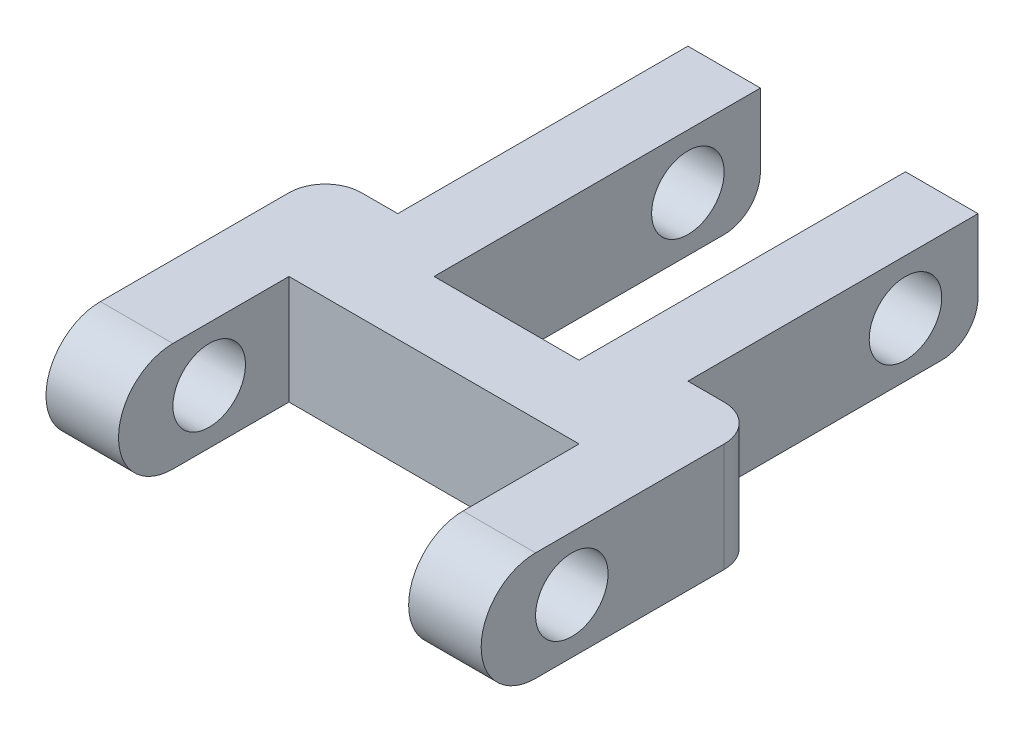
ISO-10303-21;
HEADER;
FILE_DESCRIPTION(('STEP AP214'),'2;1');
FILE_NAME('part.step','',(''),(''),'','','');
FILE_SCHEMA(('AUTOMOTIVE_DESIGN { 1 0 10303 214 1 1 1 1 }'));
ENDSEC;
DATA;
#1=APPLICATION_CONTEXT('core data for automotive mechanical design processes');
#2=APPLICATION_PROTOCOL_DEFINITION('international standard','automotive_design',2000,#1);
#3=PRODUCT_CONTEXT('',#1,'mechanical');
#4=PRODUCT('Part','Part','',(#3));
#5=PRODUCT_RELATED_PRODUCT_CATEGORY('part','',(#4));
#6=PRODUCT_DEFINITION_FORMATION('','',#4);
#7=PRODUCT_DEFINITION_CONTEXT('part definition',#1,'design');
#8=PRODUCT_DEFINITION('design','',#6,#7);
#9=PRODUCT_DEFINITION_SHAPE('','',#8);
#10=(LENGTH_UNIT() NAMED_UNIT(*) SI_UNIT(.MILLI.,.METRE.));
#11=(NAMED_UNIT(*) PLANE_ANGLE_UNIT() SI_UNIT($,.RADIAN.));
#12=(NAMED_UNIT(*) SI_UNIT($,.STERADIAN.) SOLID_ANGLE_UNIT());
#13=UNCERTAINTY_MEASURE_WITH_UNIT(LENGTH_MEASURE(1.E-05),#10,'distance_accuracy_value','');
#14=(GEOMETRIC_REPRESENTATION_CONTEXT(3) GLOBAL_UNCERTAINTY_ASSIGNED_CONTEXT((#13)) GLOBAL_UNIT_ASSIGNED_CONTEXT((#10,
#11,#12)) REPRESENTATION_CONTEXT('',''));
#15=CARTESIAN_POINT('',(0.,0.,0.));
#16=DIRECTION('',(0.,0.,1.));
#17=DIRECTION('',(1.,0.,0.));
#18=AXIS2_PLACEMENT_3D('',#15,#16,#17);
#19=CARTESIAN_POINT('',(-6.,3.,0.));
#20=DIRECTION('',(0.,0.,1.));
#21=DIRECTION('',(1.,0.,0.));
#22=AXIS2_PLACEMENT_3D('',#19,#20,#21);
#23=PLANE('',#22);
#24=DIRECTION('',(0.,1.,0.));
#25=VECTOR('',#24,1.);
#26=CARTESIAN_POINT('',(4.,3.,0.));
#27=LINE('',#26,#25);
#28=CARTESIAN_POINT('',(4.,0.,0.));
#29=VERTEX_POINT('',#28);
#30=CARTESIAN_POINT('',(4.,3.,0.));
#31=VERTEX_POINT('',#30);
#32=EDGE_CURVE('E204',#29,#31,#27,.T.);
#33=ORIENTED_EDGE('',*,*,#32,.T.);
#34=DIRECTION('',(-1.,0.,0.));
#35=VECTOR('',#34,1.);
#36=CARTESIAN_POINT('',(-6.,3.,0.));
#37=LINE('',#36,#35);
#38=CARTESIAN_POINT('',(5.,3.,0.));
#39=VERTEX_POINT('',#38);
#40=EDGE_CURVE('E278',#39,#31,#37,.T.);
#41=ORIENTED_EDGE('',*,*,#40,.F.);
#42=DIRECTION('',(0.,-1.,0.));
#43=VECTOR('',#42,1.);
#44=CARTESIAN_POINT('',(5.,3.,0.));
#45=LINE('',#44,#43);
#46=CARTESIAN_POINT('',(5.,0.,0.));
#47=VERTEX_POINT('',#46);
#48=EDGE_CURVE('E308',#39,#47,#45,.T.);
#49=ORIENTED_EDGE('',*,*,#48,.T.);
#50=DIRECTION('',(-1.,0.,0.));
#51=VECTOR('',#50,1.);
#52=CARTESIAN_POINT('',(-6.,0.,0.));
#53=LINE('',#52,#51);
#54=EDGE_CURVE('E294',#47,#29,#53,.T.);
#55=ORIENTED_EDGE('',*,*,#54,.T.);
#56=EDGE_LOOP('',(#33,#41,#49,#55));
#57=FACE_BOUND('',#56,.T.);
#58=ADVANCED_FACE('F35',(#57),#23,.F.);
#59=DIRECTION('',(0.,-1.,0.));
#60=VECTOR('',#59,1.);
#61=CARTESIAN_POINT('',(-4.,0.,0.));
#62=LINE('',#61,#60);
#63=CARTESIAN_POINT('',(-4.,3.,0.));
#64=VERTEX_POINT('',#63);
#65=CARTESIAN_POINT('',(-4.,0.,0.));
#66=VERTEX_POINT('',#65);
#67=EDGE_CURVE('E202',#64,#66,#62,.T.);
#68=ORIENTED_EDGE('',*,*,#67,.T.);
#69=CARTESIAN_POINT('',(-5.,0.,0.));
#70=VERTEX_POINT('',#69);
#71=EDGE_CURVE('E293',#66,#70,#53,.T.);
#72=ORIENTED_EDGE('',*,*,#71,.T.);
#73=DIRECTION('',(0.,-1.,0.));
#74=VECTOR('',#73,1.);
#75=CARTESIAN_POINT('',(-5.,3.,0.));
#76=LINE('',#75,#74);
#77=CARTESIAN_POINT('',(-5.,3.,0.));
#78=VERTEX_POINT('',#77);
#79=EDGE_CURVE('E305',#70,#78,#76,.F.);
#80=ORIENTED_EDGE('',*,*,#79,.T.);
#81=EDGE_CURVE('E277',#64,#78,#37,.T.);
#82=ORIENTED_EDGE('',*,*,#81,.F.);
#83=EDGE_LOOP('',(#68,#72,#80,#82));
#84=FACE_BOUND('',#83,.T.);
#85=ADVANCED_FACE('F358',(#84),#23,.F.);
#86=CARTESIAN_POINT('',(-4.,3.,8.7));
#87=DIRECTION('',(-1.,0.,0.));
#88=DIRECTION('',(0.,0.,1.));
#89=AXIS2_PLACEMENT_3D('',#86,#87,#88);
#90=PLANE('',#89);
#91=CARTESIAN_POINT('',(-4.,1.5,5.2));
#92=DIRECTION('',(-1.,0.,0.));
#93=DIRECTION('',(0.,0.,1.));
#94=AXIS2_PLACEMENT_3D('',#91,#92,#93);
#95=CIRCLE('',#94,1.);
#96=CARTESIAN_POINT('',(-4.,1.5,6.2));
#97=VERTEX_POINT('',#96);
#98=EDGE_CURVE('E247',#97,#97,#95,.T.);
#99=ORIENTED_EDGE('',*,*,#98,.T.);
#100=EDGE_LOOP('',(#99));
#101=FACE_BOUND('',#100,.T.);
#102=CARTESIAN_POINT('',(-4.,1.5,6.2));
#103=DIRECTION('',(-1.,0.,0.));
#104=DIRECTION('',(0.,0.,1.));
#105=AXIS2_PLACEMENT_3D('',#102,#103,#104);
#106=CIRCLE('',#105,1.5);
#107=CARTESIAN_POINT('',(-4.,0.,6.2));
#108=VERTEX_POINT('',#107);
#109=CARTESIAN_POINT('',(-4.,3.,6.2));
#110=VERTEX_POINT('',#109);
#111=EDGE_CURVE('E263',#108,#110,#106,.T.);
#112=ORIENTED_EDGE('',*,*,#111,.F.);
#113=DIRECTION('',(0.,0.,-1.));
#114=VECTOR('',#113,1.);
#115=CARTESIAN_POINT('',(-4.,0.,8.7));
#116=LINE('',#115,#114);
#117=CARTESIAN_POINT('',(-4.,0.,3.));
#118=VERTEX_POINT('',#117);
#119=EDGE_CURVE('E265',#108,#118,#116,.T.);
#120=ORIENTED_EDGE('',*,*,#119,.T.);
#121=DIRECTION('',(0.,-1.,0.));
#122=VECTOR('',#121,1.);
#123=CARTESIAN_POINT('',(-4.,3.,3.));
#124=LINE('',#123,#122);
#125=CARTESIAN_POINT('',(-4.,3.,3.));
#126=VERTEX_POINT('',#125);
#127=EDGE_CURVE('E299',#126,#118,#124,.T.);
#128=ORIENTED_EDGE('',*,*,#127,.F.);
#129=DIRECTION('',(0.,0.,-1.));
#130=VECTOR('',#129,1.);
#131=CARTESIAN_POINT('',(-4.,3.,8.7));
#132=LINE('',#131,#130);
#133=EDGE_CURVE('E266',#110,#126,#132,.T.);
#134=ORIENTED_EDGE('',*,*,#133,.F.);
#135=EDGE_LOOP('',(#112,#120,#128,#134));
#136=FACE_BOUND('',#135,.T.);
#137=ADVANCED_FACE('F389',(#101,#136),#90,.F.);
#138=CARTESIAN_POINT('',(4.,3.,3.));
#139=DIRECTION('',(1.,0.,0.));
#140=DIRECTION('',(0.,0.,-1.));
#141=AXIS2_PLACEMENT_3D('',#138,#139,#140);
#142=PLANE('',#141);
#143=CARTESIAN_POINT('',(4.,1.5,5.2));
#144=DIRECTION('',(1.,0.,0.));
#145=DIRECTION('',(0.,0.,-1.));
#146=AXIS2_PLACEMENT_3D('',#143,#144,#145);
#147=CIRCLE('',#146,1.);
#148=CARTESIAN_POINT('',(4.,1.5,4.2));
#149=VERTEX_POINT('',#148);
#150=EDGE_CURVE('E242',#149,#149,#147,.T.);
#151=ORIENTED_EDGE('',*,*,#150,.T.);
#152=EDGE_LOOP('',(#151));
#153=FACE_BOUND('',#152,.T.);
#154=CARTESIAN_POINT('',(4.,1.5,6.2));
#155=DIRECTION('',(1.,0.,0.));
#156=DIRECTION('',(0.,0.,-1.));
#157=AXIS2_PLACEMENT_3D('',#154,#155,#156);
#158=CIRCLE('',#157,1.5);
#159=CARTESIAN_POINT('',(4.,3.,6.2));
#160=VERTEX_POINT('',#159);
#161=CARTESIAN_POINT('',(4.,0.,6.2));
#162=VERTEX_POINT('',#161);
#163=EDGE_CURVE('E259',#160,#162,#158,.T.);
#164=ORIENTED_EDGE('',*,*,#163,.F.);
#165=DIRECTION('',(0.,0.,1.));
#166=VECTOR('',#165,1.);
#167=CARTESIAN_POINT('',(4.,3.,3.));
#168=LINE('',#167,#166);
#169=CARTESIAN_POINT('',(4.,3.,3.));
#170=VERTEX_POINT('',#169);
#171=EDGE_CURVE('E271',#170,#160,#168,.T.);
#172=ORIENTED_EDGE('',*,*,#171,.F.);
#173=DIRECTION('',(0.,-1.,0.));
#174=VECTOR('',#173,1.);
#175=CARTESIAN_POINT('',(4.,3.,3.));
#176=LINE('',#175,#174);
#177=CARTESIAN_POINT('',(4.,0.,3.));
#178=VERTEX_POINT('',#177);
#179=EDGE_CURVE('E283',#170,#178,#176,.T.);
#180=ORIENTED_EDGE('',*,*,#179,.T.);
#181=DIRECTION('',(0.,0.,1.));
#182=VECTOR('',#181,1.);
#183=CARTESIAN_POINT('',(4.,0.,3.));
#184=LINE('',#183,#182);
#185=EDGE_CURVE('E287',#178,#162,#184,.T.);
#186=ORIENTED_EDGE('',*,*,#185,.T.);
#187=EDGE_LOOP('',(#164,#172,#180,#186));
#188=FACE_BOUND('',#187,.T.);
#189=ADVANCED_FACE('F396',(#153,#188),#142,.F.);
#190=CARTESIAN_POINT('',(6.,3.,8.7));
#191=DIRECTION('',(-1.,0.,0.));
#192=DIRECTION('',(0.,0.,1.));
#193=AXIS2_PLACEMENT_3D('',#190,#191,#192);
#194=PLANE('',#193);
#195=CARTESIAN_POINT('',(6.,1.5,5.2));
#196=DIRECTION('',(-1.,0.,0.));
#197=DIRECTION('',(0.,0.,1.));
#198=AXIS2_PLACEMENT_3D('',#195,#196,#197);
#199=CIRCLE('',#198,1.);
#200=CARTESIAN_POINT('',(6.,1.5,6.2));
#201=VERTEX_POINT('',#200);
#202=EDGE_CURVE('E239',#201,#201,#199,.T.);
#203=ORIENTED_EDGE('',*,*,#202,.T.);
#204=EDGE_LOOP('',(#203));
#205=FACE_BOUND('',#204,.T.);
#206=DIRECTION('',(0.,0.,-1.));
#207=VECTOR('',#206,1.);
#208=CARTESIAN_POINT('',(6.,0.,8.7));
#209=LINE('',#208,#207);
#210=CARTESIAN_POINT('',(6.00000000000001,0.,6.2));
#211=VERTEX_POINT('',#210);
#212=CARTESIAN_POINT('',(6.,0.,1.));
#213=VERTEX_POINT('',#212);
#214=EDGE_CURVE('E290',#211,#213,#209,.T.);
#215=ORIENTED_EDGE('',*,*,#214,.T.);
#216=DIRECTION('',(0.,-1.,0.));
#217=VECTOR('',#216,1.);
#218=CARTESIAN_POINT('',(6.,3.,1.));
#219=LINE('',#218,#217);
#220=CARTESIAN_POINT('',(6.,3.,1.));
#221=VERTEX_POINT('',#220);
#222=EDGE_CURVE('E316',#213,#221,#219,.F.);
#223=ORIENTED_EDGE('',*,*,#222,.T.);
#224=DIRECTION('',(0.,0.,-1.));
#225=VECTOR('',#224,1.);
#226=CARTESIAN_POINT('',(6.,3.,8.7));
#227=LINE('',#226,#225);
#228=CARTESIAN_POINT('',(6.00000000000001,3.,6.2));
#229=VERTEX_POINT('',#228);
#230=EDGE_CURVE('E274',#229,#221,#227,.T.);
#231=ORIENTED_EDGE('',*,*,#230,.F.);
#232=CARTESIAN_POINT('',(6.00000000000001,1.5,6.2));
#233=DIRECTION('',(-1.,0.,0.));
#234=DIRECTION('',(0.,0.,1.));
#235=AXIS2_PLACEMENT_3D('',#232,#233,#234);
#236=CIRCLE('',#235,1.5);
#237=EDGE_CURVE('E251',#211,#229,#236,.T.);
#238=ORIENTED_EDGE('',*,*,#237,.F.);
#239=EDGE_LOOP('',(#215,#223,#231,#238));
#240=FACE_BOUND('',#239,.T.);
#241=ADVANCED_FACE('F393',(#205,#240),#194,.F.);
#242=CARTESIAN_POINT('',(-6.,3.,0.));
#243=DIRECTION('',(1.,0.,0.));
#244=DIRECTION('',(0.,0.,-1.));
#245=AXIS2_PLACEMENT_3D('',#242,#243,#244);
#246=PLANE('',#245);
#247=CARTESIAN_POINT('',(-6.,1.5,5.2));
#248=DIRECTION('',(-1.,0.,0.));
#249=DIRECTION('',(0.,0.,1.));
#250=AXIS2_PLACEMENT_3D('',#247,#248,#249);
#251=CIRCLE('',#250,1.);
#252=CARTESIAN_POINT('',(-6.,1.5,6.2));
#253=VERTEX_POINT('',#252);
#254=EDGE_CURVE('E238',#253,#253,#251,.T.);
#255=ORIENTED_EDGE('',*,*,#254,.F.);
#256=EDGE_LOOP('',(#255));
#257=FACE_BOUND('',#256,.T.);
#258=DIRECTION('',(0.,0.,1.));
#259=VECTOR('',#258,1.);
#260=CARTESIAN_POINT('',(-6.,3.,0.));
#261=LINE('',#260,#259);
#262=CARTESIAN_POINT('',(-6.,3.,1.));
#263=VERTEX_POINT('',#262);
#264=CARTESIAN_POINT('',(-6.,3.,6.2));
#265=VERTEX_POINT('',#264);
#266=EDGE_CURVE('E281',#263,#265,#261,.T.);
#267=ORIENTED_EDGE('',*,*,#266,.F.);
#268=DIRECTION('',(0.,-1.,0.));
#269=VECTOR('',#268,1.);
#270=CARTESIAN_POINT('',(-6.,3.,1.));
#271=LINE('',#270,#269);
#272=CARTESIAN_POINT('',(-6.,0.,1.));
#273=VERTEX_POINT('',#272);
#274=EDGE_CURVE('E322',#263,#273,#271,.T.);
#275=ORIENTED_EDGE('',*,*,#274,.T.);
#276=DIRECTION('',(0.,0.,1.));
#277=VECTOR('',#276,1.);
#278=CARTESIAN_POINT('',(-6.,0.,0.));
#279=LINE('',#278,#277);
#280=CARTESIAN_POINT('',(-6.,0.,6.2));
#281=VERTEX_POINT('',#280);
#282=EDGE_CURVE('E269',#273,#281,#279,.T.);
#283=ORIENTED_EDGE('',*,*,#282,.T.);
#284=CARTESIAN_POINT('',(-6.,1.5,6.2));
#285=DIRECTION('',(-1.,0.,0.));
#286=DIRECTION('',(0.,0.,1.));
#287=AXIS2_PLACEMENT_3D('',#284,#285,#286);
#288=CIRCLE('',#287,1.5);
#289=EDGE_CURVE('E250',#281,#265,#288,.T.);
#290=ORIENTED_EDGE('',*,*,#289,.T.);
#291=EDGE_LOOP('',(#267,#275,#283,#290));
#292=FACE_BOUND('',#291,.T.);
#293=ADVANCED_FACE('F367',(#257,#292),#246,.F.);
#294=CARTESIAN_POINT('',(0.,3.,0.));
#295=DIRECTION('',(0.,-1.,0.));
#296=DIRECTION('',(0.,0.,-1.));
#297=AXIS2_PLACEMENT_3D('',#294,#295,#296);
#298=PLANE('',#297);
#299=DIRECTION('',(1.,0.,0.));
#300=VECTOR('',#299,1.);
#301=CARTESIAN_POINT('',(-2.,3.,1.));
#302=LINE('',#301,#300);
#303=CARTESIAN_POINT('',(-2.,3.,1.));
#304=VERTEX_POINT('',#303);
#305=CARTESIAN_POINT('',(2.,3.,1.));
#306=VERTEX_POINT('',#305);
#307=EDGE_CURVE('E192',#304,#306,#302,.T.);
#308=ORIENTED_EDGE('',*,*,#307,.F.);
#309=DIRECTION('',(0.,0.,1.));
#310=VECTOR('',#309,1.);
#311=CARTESIAN_POINT('',(-2.,3.,-3.));
#312=LINE('',#311,#310);
#313=CARTESIAN_POINT('',(-2.,3.,-8.));
#314=VERTEX_POINT('',#313);
#315=EDGE_CURVE('E174',#314,#304,#312,.T.);
#316=ORIENTED_EDGE('',*,*,#315,.F.);
#317=DIRECTION('',(1.,0.,0.));
#318=VECTOR('',#317,1.);
#319=CARTESIAN_POINT('',(4.,3.,-8.));
#320=LINE('',#319,#318);
#321=CARTESIAN_POINT('',(-4.,3.,-8.));
#322=VERTEX_POINT('',#321);
#323=EDGE_CURVE('E227',#322,#314,#320,.T.);
#324=ORIENTED_EDGE('',*,*,#323,.F.);
#325=DIRECTION('',(0.,0.,1.));
#326=VECTOR('',#325,1.);
#327=CARTESIAN_POINT('',(-4.,3.,-8.));
#328=LINE('',#327,#326);
#329=EDGE_CURVE('E235',#322,#64,#328,.T.);
#330=ORIENTED_EDGE('',*,*,#329,.T.);
#331=ORIENTED_EDGE('',*,*,#81,.T.);
#332=CARTESIAN_POINT('',(-5.,3.,1.));
#333=DIRECTION('',(0.,-1.,0.));
#334=DIRECTION('',(0.,0.,-1.));
#335=AXIS2_PLACEMENT_3D('',#332,#333,#334);
#336=CIRCLE('',#335,1.);
#337=EDGE_CURVE('E318',#78,#263,#336,.F.);
#338=ORIENTED_EDGE('',*,*,#337,.T.);
#339=ORIENTED_EDGE('',*,*,#266,.T.);
#340=DIRECTION('',(-1.,0.,0.));
#341=VECTOR('',#340,1.);
#342=CARTESIAN_POINT('',(6.00000000000001,3.,6.2));
#343=LINE('',#342,#341);
#344=EDGE_CURVE('E253',#110,#265,#343,.T.);
#345=ORIENTED_EDGE('',*,*,#344,.F.);
#346=ORIENTED_EDGE('',*,*,#133,.T.);
#347=DIRECTION('',(1.,0.,0.));
#348=VECTOR('',#347,1.);
#349=CARTESIAN_POINT('',(-4.,3.,3.));
#350=LINE('',#349,#348);
#351=EDGE_CURVE('E268',#126,#170,#350,.T.);
#352=ORIENTED_EDGE('',*,*,#351,.T.);
#353=ORIENTED_EDGE('',*,*,#171,.T.);
#354=EDGE_CURVE('E260',#229,#160,#343,.T.);
#355=ORIENTED_EDGE('',*,*,#354,.F.);
#356=ORIENTED_EDGE('',*,*,#230,.T.);
#357=CARTESIAN_POINT('',(5.,3.,1.));
#358=DIRECTION('',(0.,-1.,0.));
#359=DIRECTION('',(0.,0.,-1.));
#360=AXIS2_PLACEMENT_3D('',#357,#358,#359);
#361=CIRCLE('',#360,1.);
#362=EDGE_CURVE('E320',#221,#39,#361,.F.);
#363=ORIENTED_EDGE('',*,*,#362,.T.);
#364=ORIENTED_EDGE('',*,*,#40,.T.);
#365=DIRECTION('',(0.,0.,1.));
#366=VECTOR('',#365,1.);
#367=CARTESIAN_POINT('',(4.,3.,-8.));
#368=LINE('',#367,#366);
#369=CARTESIAN_POINT('',(4.,3.,-8.));
#370=VERTEX_POINT('',#369);
#371=EDGE_CURVE('E233',#370,#31,#368,.T.);
#372=ORIENTED_EDGE('',*,*,#371,.F.);
#373=CARTESIAN_POINT('',(2.,3.,-8.));
#374=VERTEX_POINT('',#373);
#375=EDGE_CURVE('E226',#374,#370,#320,.T.);
#376=ORIENTED_EDGE('',*,*,#375,.F.);
#377=DIRECTION('',(0.,0.,-1.));
#378=VECTOR('',#377,1.);
#379=CARTESIAN_POINT('',(2.,3.,-8.));
#380=LINE('',#379,#378);
#381=EDGE_CURVE('E186',#306,#374,#380,.T.);
#382=ORIENTED_EDGE('',*,*,#381,.F.);
#383=EDGE_LOOP('',(#308,#316,#324,#330,#331,#338,#339,#345,#346,#352,#353,#355,#356,#363,#364,
#372,#376,#382));
#384=FACE_BOUND('',#383,.T.);
#385=ADVANCED_FACE('F196',(#384),#298,.F.);
#386=CARTESIAN_POINT('',(0.,0.,0.));
#387=DIRECTION('',(0.,-1.,0.));
#388=DIRECTION('',(0.,0.,-1.));
#389=AXIS2_PLACEMENT_3D('',#386,#387,#388);
#390=PLANE('',#389);
#391=DIRECTION('',(0.,0.,1.));
#392=VECTOR('',#391,1.);
#393=CARTESIAN_POINT('',(-2.,0.,-8.));
#394=LINE('',#393,#392);
#395=CARTESIAN_POINT('',(-2.,0.,-7.));
#396=VERTEX_POINT('',#395);
#397=CARTESIAN_POINT('',(-2.,0.,1.));
#398=VERTEX_POINT('',#397);
#399=EDGE_CURVE('E216',#396,#398,#394,.T.);
#400=ORIENTED_EDGE('',*,*,#399,.T.);
#401=DIRECTION('',(-1.,0.,0.));
#402=VECTOR('',#401,1.);
#403=CARTESIAN_POINT('',(0.,0.,1.));
#404=LINE('',#403,#402);
#405=CARTESIAN_POINT('',(2.,0.,1.));
#406=VERTEX_POINT('',#405);
#407=EDGE_CURVE('E12',#406,#398,#404,.T.);
#408=ORIENTED_EDGE('',*,*,#407,.F.);
#409=DIRECTION('',(0.,0.,-1.));
#410=VECTOR('',#409,1.);
#411=CARTESIAN_POINT('',(2.,0.,-8.));
#412=LINE('',#411,#410);
#413=CARTESIAN_POINT('',(2.,0.,-7.));
#414=VERTEX_POINT('',#413);
#415=EDGE_CURVE('E211',#406,#414,#412,.T.);
#416=ORIENTED_EDGE('',*,*,#415,.T.);
#417=DIRECTION('',(-1.,0.,0.));
#418=VECTOR('',#417,1.);
#419=CARTESIAN_POINT('',(-4.,0.,-7.));
#420=LINE('',#419,#418);
#421=CARTESIAN_POINT('',(4.,0.,-7.));
#422=VERTEX_POINT('',#421);
#423=EDGE_CURVE('E336',#414,#422,#420,.F.);
#424=ORIENTED_EDGE('',*,*,#423,.T.);
#425=DIRECTION('',(0.,0.,1.));
#426=VECTOR('',#425,1.);
#427=CARTESIAN_POINT('',(4.,0.,-8.));
#428=LINE('',#427,#426);
#429=EDGE_CURVE('E58',#422,#29,#428,.T.);
#430=ORIENTED_EDGE('',*,*,#429,.T.);
#431=ORIENTED_EDGE('',*,*,#54,.F.);
#432=CARTESIAN_POINT('',(5.,0.,1.));
#433=DIRECTION('',(0.,-1.,0.));
#434=DIRECTION('',(0.,0.,-1.));
#435=AXIS2_PLACEMENT_3D('',#432,#433,#434);
#436=CIRCLE('',#435,1.);
#437=EDGE_CURVE('E314',#47,#213,#436,.T.);
#438=ORIENTED_EDGE('',*,*,#437,.T.);
#439=ORIENTED_EDGE('',*,*,#214,.F.);
#440=DIRECTION('',(-1.,0.,0.));
#441=VECTOR('',#440,1.);
#442=CARTESIAN_POINT('',(6.00000000000001,0.,6.2));
#443=LINE('',#442,#441);
#444=EDGE_CURVE('E256',#211,#162,#443,.T.);
#445=ORIENTED_EDGE('',*,*,#444,.T.);
#446=ORIENTED_EDGE('',*,*,#185,.F.);
#447=DIRECTION('',(1.,0.,0.));
#448=VECTOR('',#447,1.);
#449=CARTESIAN_POINT('',(-4.,0.,3.));
#450=LINE('',#449,#448);
#451=EDGE_CURVE('E285',#118,#178,#450,.T.);
#452=ORIENTED_EDGE('',*,*,#451,.F.);
#453=ORIENTED_EDGE('',*,*,#119,.F.);
#454=DIRECTION('',(-1.,0.,0.));
#455=VECTOR('',#454,1.);
#456=CARTESIAN_POINT('',(6.00000000000001,0.,6.2));
#457=LINE('',#456,#455);
#458=EDGE_CURVE('E302',#108,#281,#457,.T.);
#459=ORIENTED_EDGE('',*,*,#458,.T.);
#460=ORIENTED_EDGE('',*,*,#282,.F.);
#461=CARTESIAN_POINT('',(-5.,0.,1.));
#462=DIRECTION('',(0.,-1.,0.));
#463=DIRECTION('',(0.,0.,-1.));
#464=AXIS2_PLACEMENT_3D('',#461,#462,#463);
#465=CIRCLE('',#464,1.);
#466=EDGE_CURVE('E311',#273,#70,#465,.T.);
#467=ORIENTED_EDGE('',*,*,#466,.T.);
#468=ORIENTED_EDGE('',*,*,#71,.F.);
#469=DIRECTION('',(0.,0.,1.));
#470=VECTOR('',#469,1.);
#471=CARTESIAN_POINT('',(-4.,0.,-8.));
#472=LINE('',#471,#470);
#473=CARTESIAN_POINT('',(-4.,0.,-7.));
#474=VERTEX_POINT('',#473);
#475=EDGE_CURVE('E50',#474,#66,#472,.T.);
#476=ORIENTED_EDGE('',*,*,#475,.F.);
#477=DIRECTION('',(-1.,0.,0.));
#478=VECTOR('',#477,1.);
#479=CARTESIAN_POINT('',(-4.,0.,-7.));
#480=LINE('',#479,#478);
#481=EDGE_CURVE('E334',#474,#396,#480,.F.);
#482=ORIENTED_EDGE('',*,*,#481,.T.);
#483=EDGE_LOOP('',(#400,#408,#416,#424,#430,#431,#438,#439,#445,#446,#452,#453,#459,#460,#467,
#468,#476,#482));
#484=FACE_BOUND('',#483,.T.);
#485=ADVANCED_FACE('F354',(#484),#390,.T.);
#486=CARTESIAN_POINT('',(-4.,3.,3.));
#487=DIRECTION('',(0.,0.,-1.));
#488=DIRECTION('',(-1.,0.,0.));
#489=AXIS2_PLACEMENT_3D('',#486,#487,#488);
#490=PLANE('',#489);
#491=ORIENTED_EDGE('',*,*,#451,.T.);
#492=ORIENTED_EDGE('',*,*,#179,.F.);
#493=ORIENTED_EDGE('',*,*,#351,.F.);
#494=ORIENTED_EDGE('',*,*,#127,.T.);
#495=EDGE_LOOP('',(#491,#492,#493,#494));
#496=FACE_BOUND('',#495,.T.);
#497=ADVANCED_FACE('F401',(#496),#490,.F.);
#498=CARTESIAN_POINT('',(6.00000000000001,1.5,6.2));
#499=DIRECTION('',(-1.,0.,0.));
#500=DIRECTION('',(0.,0.,1.));
#501=AXIS2_PLACEMENT_3D('',#498,#499,#500);
#502=CYLINDRICAL_SURFACE('',#501,1.5);
#503=ORIENTED_EDGE('',*,*,#111,.T.);
#504=ORIENTED_EDGE('',*,*,#344,.T.);
#505=ORIENTED_EDGE('',*,*,#289,.F.);
#506=ORIENTED_EDGE('',*,*,#458,.F.);
#507=EDGE_LOOP('',(#503,#504,#505,#506));
#508=FACE_BOUND('',#507,.T.);
#509=ADVANCED_FACE('F404',(#508),#502,.T.);
#510=ORIENTED_EDGE('',*,*,#163,.T.);
#511=ORIENTED_EDGE('',*,*,#444,.F.);
#512=ORIENTED_EDGE('',*,*,#237,.T.);
#513=ORIENTED_EDGE('',*,*,#354,.T.);
#514=EDGE_LOOP('',(#510,#511,#512,#513));
#515=FACE_BOUND('',#514,.T.);
#516=ADVANCED_FACE('F424',(#515),#502,.T.);
#517=CARTESIAN_POINT('',(6.,1.5,5.2));
#518=DIRECTION('',(-1.,0.,0.));
#519=DIRECTION('',(0.,0.,1.));
#520=AXIS2_PLACEMENT_3D('',#517,#518,#519);
#521=CYLINDRICAL_SURFACE('',#520,1.);
#522=ORIENTED_EDGE('',*,*,#254,.T.);
#523=EDGE_LOOP('',(#522));
#524=FACE_BOUND('',#523,.T.);
#525=ORIENTED_EDGE('',*,*,#98,.F.);
#526=EDGE_LOOP('',(#525));
#527=FACE_BOUND('',#526,.T.);
#528=ADVANCED_FACE('F429',(#524,#527),#521,.F.);
#529=ORIENTED_EDGE('',*,*,#202,.F.);
#530=EDGE_LOOP('',(#529));
#531=FACE_BOUND('',#530,.T.);
#532=ORIENTED_EDGE('',*,*,#150,.F.);
#533=EDGE_LOOP('',(#532));
#534=FACE_BOUND('',#533,.T.);
#535=ADVANCED_FACE('F380',(#531,#534),#521,.F.);
#536=CARTESIAN_POINT('',(5.,3.,1.));
#537=DIRECTION('',(0.,-1.,0.));
#538=DIRECTION('',(0.,0.,-1.));
#539=AXIS2_PLACEMENT_3D('',#536,#537,#538);
#540=CYLINDRICAL_SURFACE('',#539,1.);
#541=ORIENTED_EDGE('',*,*,#362,.F.);
#542=ORIENTED_EDGE('',*,*,#222,.F.);
#543=ORIENTED_EDGE('',*,*,#437,.F.);
#544=ORIENTED_EDGE('',*,*,#48,.F.);
#545=EDGE_LOOP('',(#541,#542,#543,#544));
#546=FACE_BOUND('',#545,.T.);
#547=ADVANCED_FACE('F372',(#546),#540,.T.);
#548=CARTESIAN_POINT('',(-5.,3.,1.));
#549=DIRECTION('',(0.,-1.,0.));
#550=DIRECTION('',(0.,0.,-1.));
#551=AXIS2_PLACEMENT_3D('',#548,#549,#550);
#552=CYLINDRICAL_SURFACE('',#551,1.);
#553=ORIENTED_EDGE('',*,*,#337,.F.);
#554=ORIENTED_EDGE('',*,*,#79,.F.);
#555=ORIENTED_EDGE('',*,*,#466,.F.);
#556=ORIENTED_EDGE('',*,*,#274,.F.);
#557=EDGE_LOOP('',(#553,#554,#555,#556));
#558=FACE_BOUND('',#557,.T.);
#559=ADVANCED_FACE('F369',(#558),#552,.T.);
#560=CARTESIAN_POINT('',(0.,1.,-7.));
#561=DIRECTION('',(-1.,0.,0.));
#562=DIRECTION('',(0.,0.,1.));
#563=AXIS2_PLACEMENT_3D('',#560,#561,#562);
#564=CYLINDRICAL_SURFACE('',#563,1.);
#565=CARTESIAN_POINT('',(4.,1.,-7.));
#566=DIRECTION('',(-1.,0.,0.));
#567=DIRECTION('',(0.,-1.,0.));
#568=AXIS2_PLACEMENT_3D('',#565,#566,#567);
#569=CIRCLE('',#568,1.);
#570=CARTESIAN_POINT('',(4.,1.,-8.));
#571=VERTEX_POINT('',#570);
#572=EDGE_CURVE('E338',#422,#571,#569,.F.);
#573=ORIENTED_EDGE('',*,*,#572,.F.);
#574=ORIENTED_EDGE('',*,*,#423,.F.);
#575=CARTESIAN_POINT('',(2.,1.,-7.));
#576=DIRECTION('',(1.,0.,0.));
#577=DIRECTION('',(0.,0.,-1.));
#578=AXIS2_PLACEMENT_3D('',#575,#576,#577);
#579=CIRCLE('',#578,1.);
#580=CARTESIAN_POINT('',(2.,1.,-8.));
#581=VERTEX_POINT('',#580);
#582=EDGE_CURVE('E332',#581,#414,#579,.F.);
#583=ORIENTED_EDGE('',*,*,#582,.F.);
#584=DIRECTION('',(-1.,0.,0.));
#585=VECTOR('',#584,1.);
#586=CARTESIAN_POINT('',(0.,1.,-8.));
#587=LINE('',#586,#585);
#588=EDGE_CURVE('E325',#571,#581,#587,.T.);
#589=ORIENTED_EDGE('',*,*,#588,.F.);
#590=EDGE_LOOP('',(#573,#574,#583,#589));
#591=FACE_BOUND('',#590,.T.);
#592=ADVANCED_FACE('F371',(#591),#564,.T.);
#593=CARTESIAN_POINT('',(-8.,1.49999999999999,-6.));
#594=DIRECTION('',(1.,0.,0.));
#595=DIRECTION('',(0.,1.,0.));
#596=AXIS2_PLACEMENT_3D('',#593,#594,#595);
#597=CYLINDRICAL_SURFACE('',#596,1.);
#598=CARTESIAN_POINT('',(2.,1.5,-6.));
#599=DIRECTION('',(1.,0.,0.));
#600=DIRECTION('',(0.,0.,-1.));
#601=AXIS2_PLACEMENT_3D('',#598,#599,#600);
#602=CIRCLE('',#601,1.);
#603=CARTESIAN_POINT('',(2.,1.5,-7.));
#604=VERTEX_POINT('',#603);
#605=EDGE_CURVE('E210',#604,#604,#602,.F.);
#606=ORIENTED_EDGE('',*,*,#605,.T.);
#607=EDGE_LOOP('',(#606));
#608=FACE_BOUND('',#607,.T.);
#609=CARTESIAN_POINT('',(4.,1.5,-6.));
#610=DIRECTION('',(1.,0.,0.));
#611=DIRECTION('',(0.,1.,0.));
#612=AXIS2_PLACEMENT_3D('',#609,#610,#611);
#613=CIRCLE('',#612,1.);
#614=CARTESIAN_POINT('',(4.,2.5,-6.));
#615=VERTEX_POINT('',#614);
#616=EDGE_CURVE('E218',#615,#615,#613,.T.);
#617=ORIENTED_EDGE('',*,*,#616,.T.);
#618=EDGE_LOOP('',(#617));
#619=FACE_BOUND('',#618,.T.);
#620=ADVANCED_FACE('F378',(#608,#619),#597,.F.);
#621=CARTESIAN_POINT('',(2.,-5.,-8.));
#622=DIRECTION('',(1.,0.,0.));
#623=DIRECTION('',(0.,0.,-1.));
#624=AXIS2_PLACEMENT_3D('',#621,#622,#623);
#625=PLANE('',#624);
#626=ORIENTED_EDGE('',*,*,#605,.F.);
#627=EDGE_LOOP('',(#626));
#628=FACE_BOUND('',#627,.T.);
#629=DIRECTION('',(0.,1.,0.));
#630=VECTOR('',#629,1.);
#631=CARTESIAN_POINT('',(2.,-5.,-8.));
#632=LINE('',#631,#630);
#633=EDGE_CURVE('E185',#581,#374,#632,.T.);
#634=ORIENTED_EDGE('',*,*,#633,.F.);
#635=ORIENTED_EDGE('',*,*,#582,.T.);
#636=ORIENTED_EDGE('',*,*,#415,.F.);
#637=DIRECTION('',(0.,1.,0.));
#638=VECTOR('',#637,1.);
#639=CARTESIAN_POINT('',(2.,-7.,1.));
#640=LINE('',#639,#638);
#641=EDGE_CURVE('E194',#406,#306,#640,.T.);
#642=ORIENTED_EDGE('',*,*,#641,.T.);
#643=ORIENTED_EDGE('',*,*,#381,.T.);
#644=EDGE_LOOP('',(#634,#635,#636,#642,#643));
#645=FACE_BOUND('',#644,.T.);
#646=ADVANCED_FACE('F530',(#628,#645),#625,.F.);
#647=CARTESIAN_POINT('',(0.,0.,-8.));
#648=DIRECTION('',(0.,0.,1.));
#649=DIRECTION('',(1.,0.,0.));
#650=AXIS2_PLACEMENT_3D('',#647,#648,#649);
#651=PLANE('',#650);
#652=DIRECTION('',(0.,-1.,0.));
#653=VECTOR('',#652,1.);
#654=CARTESIAN_POINT('',(4.,0.,-8.));
#655=LINE('',#654,#653);
#656=EDGE_CURVE('E229',#370,#571,#655,.T.);
#657=ORIENTED_EDGE('',*,*,#656,.T.);
#658=ORIENTED_EDGE('',*,*,#588,.T.);
#659=ORIENTED_EDGE('',*,*,#633,.T.);
#660=ORIENTED_EDGE('',*,*,#375,.T.);
#661=EDGE_LOOP('',(#657,#658,#659,#660));
#662=FACE_BOUND('',#661,.T.);
#663=ADVANCED_FACE('F540',(#662),#651,.F.);
#664=CARTESIAN_POINT('',(-2.,-5.,-3.));
#665=DIRECTION('',(-1.,0.,0.));
#666=DIRECTION('',(0.,0.,1.));
#667=AXIS2_PLACEMENT_3D('',#664,#665,#666);
#668=PLANE('',#667);
#669=CARTESIAN_POINT('',(-2.,1.5,-6.));
#670=DIRECTION('',(-1.,0.,0.));
#671=DIRECTION('',(0.,0.,1.));
#672=AXIS2_PLACEMENT_3D('',#669,#670,#671);
#673=CIRCLE('',#672,1.);
#674=CARTESIAN_POINT('',(-2.,1.5,-5.));
#675=VERTEX_POINT('',#674);
#676=EDGE_CURVE('E214',#675,#675,#673,.F.);
#677=ORIENTED_EDGE('',*,*,#676,.F.);
#678=EDGE_LOOP('',(#677));
#679=FACE_BOUND('',#678,.T.);
#680=ORIENTED_EDGE('',*,*,#399,.F.);
#681=CARTESIAN_POINT('',(-2.,1.,-7.));
#682=DIRECTION('',(-1.,0.,0.));
#683=DIRECTION('',(0.,0.,1.));
#684=AXIS2_PLACEMENT_3D('',#681,#682,#683);
#685=CIRCLE('',#684,1.);
#686=CARTESIAN_POINT('',(-2.,1.,-8.));
#687=VERTEX_POINT('',#686);
#688=EDGE_CURVE('E43',#396,#687,#685,.F.);
#689=ORIENTED_EDGE('',*,*,#688,.T.);
#690=DIRECTION('',(0.,-1.,0.));
#691=VECTOR('',#690,1.);
#692=CARTESIAN_POINT('',(-2.,0.,-8.));
#693=LINE('',#692,#691);
#694=EDGE_CURVE('E180',#314,#687,#693,.T.);
#695=ORIENTED_EDGE('',*,*,#694,.F.);
#696=ORIENTED_EDGE('',*,*,#315,.T.);
#697=DIRECTION('',(0.,1.,0.));
#698=VECTOR('',#697,1.);
#699=CARTESIAN_POINT('',(-2.,-7.,1.));
#700=LINE('',#699,#698);
#701=EDGE_CURVE('E178',#398,#304,#700,.T.);
#702=ORIENTED_EDGE('',*,*,#701,.F.);
#703=EDGE_LOOP('',(#680,#689,#695,#696,#702));
#704=FACE_BOUND('',#703,.T.);
#705=ADVANCED_FACE('F177',(#679,#704),#668,.F.);
#706=CARTESIAN_POINT('',(0.,1.,-7.));
#707=DIRECTION('',(-1.,0.,0.));
#708=DIRECTION('',(0.,0.,1.));
#709=AXIS2_PLACEMENT_3D('',#706,#707,#708);
#710=CYLINDRICAL_SURFACE('',#709,1.);
#711=ORIENTED_EDGE('',*,*,#688,.F.);
#712=ORIENTED_EDGE('',*,*,#481,.F.);
#713=CARTESIAN_POINT('',(-4.,1.,-7.));
#714=DIRECTION('',(1.,0.,0.));
#715=DIRECTION('',(0.,0.,-1.));
#716=AXIS2_PLACEMENT_3D('',#713,#714,#715);
#717=CIRCLE('',#716,1.);
#718=CARTESIAN_POINT('',(-4.,1.,-8.));
#719=VERTEX_POINT('',#718);
#720=EDGE_CURVE('E343',#719,#474,#717,.F.);
#721=ORIENTED_EDGE('',*,*,#720,.F.);
#722=DIRECTION('',(-1.,0.,0.));
#723=VECTOR('',#722,1.);
#724=CARTESIAN_POINT('',(0.,1.,-8.));
#725=LINE('',#724,#723);
#726=EDGE_CURVE('E340',#687,#719,#725,.T.);
#727=ORIENTED_EDGE('',*,*,#726,.F.);
#728=EDGE_LOOP('',(#711,#712,#721,#727));
#729=FACE_BOUND('',#728,.T.);
#730=ADVANCED_FACE('F37',(#729),#710,.T.);
#731=ORIENTED_EDGE('',*,*,#694,.T.);
#732=ORIENTED_EDGE('',*,*,#726,.T.);
#733=DIRECTION('',(0.,1.,0.));
#734=VECTOR('',#733,1.);
#735=CARTESIAN_POINT('',(-4.,3.,-8.));
#736=LINE('',#735,#734);
#737=EDGE_CURVE('E224',#719,#322,#736,.T.);
#738=ORIENTED_EDGE('',*,*,#737,.T.);
#739=ORIENTED_EDGE('',*,*,#323,.T.);
#740=EDGE_LOOP('',(#731,#732,#738,#739));
#741=FACE_BOUND('',#740,.T.);
#742=ADVANCED_FACE('F349',(#741),#651,.F.);
#743=ORIENTED_EDGE('',*,*,#676,.T.);
#744=EDGE_LOOP('',(#743));
#745=FACE_BOUND('',#744,.T.);
#746=CARTESIAN_POINT('',(-4.,1.5,-6.));
#747=DIRECTION('',(1.,0.,0.));
#748=DIRECTION('',(0.,0.,-1.));
#749=AXIS2_PLACEMENT_3D('',#746,#747,#748);
#750=CIRCLE('',#749,1.);
#751=CARTESIAN_POINT('',(-4.,1.5,-7.));
#752=VERTEX_POINT('',#751);
#753=EDGE_CURVE('E221',#752,#752,#750,.T.);
#754=ORIENTED_EDGE('',*,*,#753,.F.);
#755=EDGE_LOOP('',(#754));
#756=FACE_BOUND('',#755,.T.);
#757=ADVANCED_FACE('F513',(#745,#756),#597,.F.);
#758=CARTESIAN_POINT('',(-4.,3.,-8.));
#759=DIRECTION('',(1.,0.,0.));
#760=DIRECTION('',(0.,0.,-1.));
#761=AXIS2_PLACEMENT_3D('',#758,#759,#760);
#762=PLANE('',#761);
#763=ORIENTED_EDGE('',*,*,#753,.T.);
#764=EDGE_LOOP('',(#763));
#765=FACE_BOUND('',#764,.T.);
#766=ORIENTED_EDGE('',*,*,#737,.F.);
#767=ORIENTED_EDGE('',*,*,#720,.T.);
#768=ORIENTED_EDGE('',*,*,#475,.T.);
#769=ORIENTED_EDGE('',*,*,#67,.F.);
#770=ORIENTED_EDGE('',*,*,#329,.F.);
#771=EDGE_LOOP('',(#766,#767,#768,#769,#770));
#772=FACE_BOUND('',#771,.T.);
#773=ADVANCED_FACE('F351',(#765,#772),#762,.F.);
#774=CARTESIAN_POINT('',(4.,0.,-8.));
#775=DIRECTION('',(-1.,0.,0.));
#776=DIRECTION('',(0.,-1.,0.));
#777=AXIS2_PLACEMENT_3D('',#774,#775,#776);
#778=PLANE('',#777);
#779=ORIENTED_EDGE('',*,*,#616,.F.);
#780=EDGE_LOOP('',(#779));
#781=FACE_BOUND('',#780,.T.);
#782=ORIENTED_EDGE('',*,*,#429,.F.);
#783=ORIENTED_EDGE('',*,*,#572,.T.);
#784=ORIENTED_EDGE('',*,*,#656,.F.);
#785=ORIENTED_EDGE('',*,*,#371,.T.);
#786=ORIENTED_EDGE('',*,*,#32,.F.);
#787=EDGE_LOOP('',(#782,#783,#784,#785,#786));
#788=FACE_BOUND('',#787,.T.);
#789=ADVANCED_FACE('F582',(#781,#788),#778,.F.);
#790=CARTESIAN_POINT('',(-2.,-7.,1.));
#791=DIRECTION('',(0.,0.,1.));
#792=DIRECTION('',(1.,0.,0.));
#793=AXIS2_PLACEMENT_3D('',#790,#791,#792);
#794=PLANE('',#793);
#795=ORIENTED_EDGE('',*,*,#407,.T.);
#796=ORIENTED_EDGE('',*,*,#701,.T.);
#797=ORIENTED_EDGE('',*,*,#307,.T.);
#798=ORIENTED_EDGE('',*,*,#641,.F.);
#799=EDGE_LOOP('',(#795,#796,#797,#798));
#800=FACE_BOUND('',#799,.T.);
#801=ADVANCED_FACE('F190',(#800),#794,.F.);
#802=CLOSED_SHELL('',(#58,#85,#137,#189,#241,#293,#385,#485,#497,#509,#516,#528,#535,#547,#559,
#592,#620,#646,#663,#705,#730,#742,#757,#773,#789,#801));
#803=MANIFOLD_SOLID_BREP('B2',#802);
#804=ADVANCED_BREP_SHAPE_REPRESENTATION('',(#18,#803),#14);
#805=SHAPE_DEFINITION_REPRESENTATION(#9,#804);
ENDSEC;
END-ISO-10303-21;
